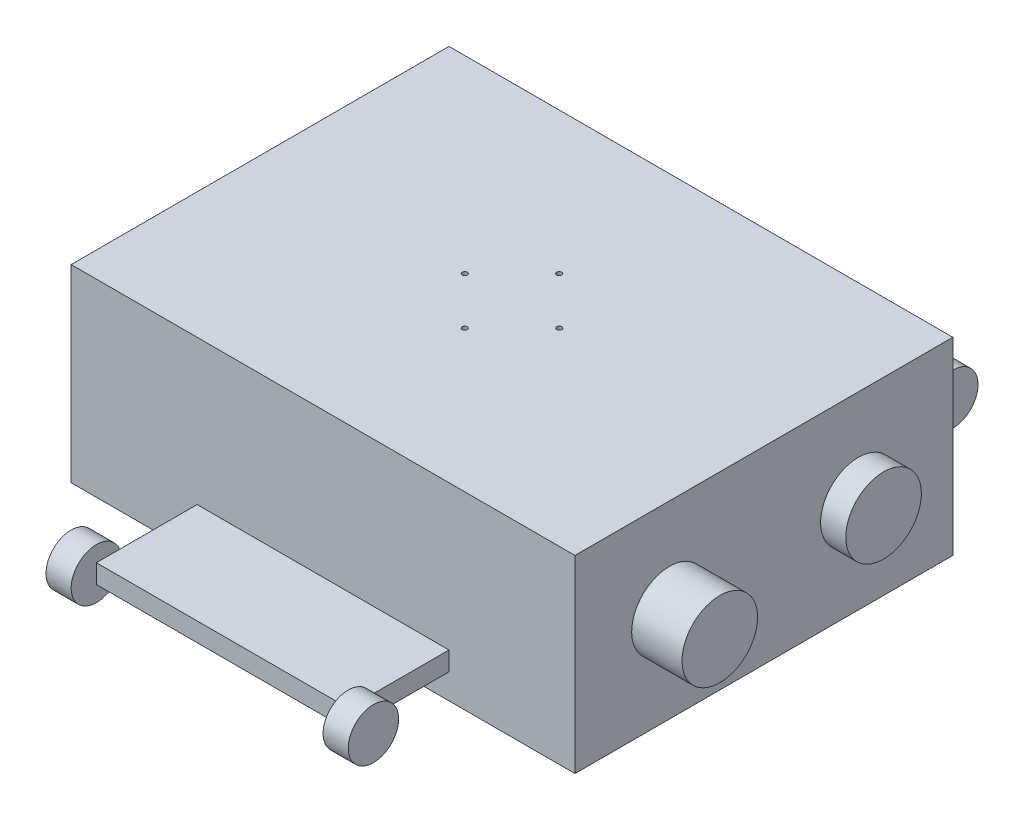
ISO-10303-21;
HEADER;
FILE_DESCRIPTION(('STEP AP214'),'2;1');
FILE_NAME('part.step','',(''),(''),'','','');
FILE_SCHEMA(('AUTOMOTIVE_DESIGN { 1 0 10303 214 1 1 1 1 }'));
ENDSEC;
DATA;
#1=APPLICATION_CONTEXT('core data for automotive mechanical design processes');
#2=APPLICATION_PROTOCOL_DEFINITION('international standard','automotive_design',2000,#1);
#3=PRODUCT_CONTEXT('',#1,'mechanical');
#4=PRODUCT('Part','Part','',(#3));
#5=PRODUCT_RELATED_PRODUCT_CATEGORY('part','',(#4));
#6=PRODUCT_DEFINITION_FORMATION('','',#4);
#7=PRODUCT_DEFINITION_CONTEXT('part definition',#1,'design');
#8=PRODUCT_DEFINITION('design','',#6,#7);
#9=PRODUCT_DEFINITION_SHAPE('','',#8);
#10=(LENGTH_UNIT() NAMED_UNIT(*) SI_UNIT(.MILLI.,.METRE.));
#11=(NAMED_UNIT(*) PLANE_ANGLE_UNIT() SI_UNIT($,.RADIAN.));
#12=(NAMED_UNIT(*) SI_UNIT($,.STERADIAN.) SOLID_ANGLE_UNIT());
#13=UNCERTAINTY_MEASURE_WITH_UNIT(LENGTH_MEASURE(1.E-05),#10,'distance_accuracy_value','');
#14=(GEOMETRIC_REPRESENTATION_CONTEXT(3) GLOBAL_UNCERTAINTY_ASSIGNED_CONTEXT((#13)) GLOBAL_UNIT_ASSIGNED_CONTEXT((#10,
#11,#12)) REPRESENTATION_CONTEXT('',''));
#15=CARTESIAN_POINT('',(0.,0.,0.));
#16=DIRECTION('',(0.,0.,1.));
#17=DIRECTION('',(1.,0.,0.));
#18=AXIS2_PLACEMENT_3D('',#15,#16,#17);
#19=CARTESIAN_POINT('',(0.,0.,0.));
#20=DIRECTION('',(0.,0.,1.));
#21=DIRECTION('',(1.,0.,0.));
#22=AXIS2_PLACEMENT_3D('',#19,#20,#21);
#23=PLANE('',#22);
#24=DIRECTION('',(0.,1.,0.));
#25=VECTOR('',#24,1.);
#26=CARTESIAN_POINT('',(200.,75.,0.));
#27=LINE('',#26,#25);
#28=CARTESIAN_POINT('',(200.,-75.,0.));
#29=VERTEX_POINT('',#28);
#30=CARTESIAN_POINT('',(200.,75.,0.));
#31=VERTEX_POINT('',#30);
#32=EDGE_CURVE('E225',#29,#31,#27,.T.);
#33=ORIENTED_EDGE('',*,*,#32,.T.);
#34=DIRECTION('',(-1.,0.,0.));
#35=VECTOR('',#34,1.);
#36=CARTESIAN_POINT('',(-200.,75.,0.));
#37=LINE('',#36,#35);
#38=CARTESIAN_POINT('',(-200.,75.,0.));
#39=VERTEX_POINT('',#38);
#40=EDGE_CURVE('E241',#31,#39,#37,.T.);
#41=ORIENTED_EDGE('',*,*,#40,.T.);
#42=DIRECTION('',(0.,-1.,0.));
#43=VECTOR('',#42,1.);
#44=CARTESIAN_POINT('',(-200.,75.,0.));
#45=LINE('',#44,#43);
#46=CARTESIAN_POINT('',(-200.,-75.,0.));
#47=VERTEX_POINT('',#46);
#48=EDGE_CURVE('E244',#39,#47,#45,.T.);
#49=ORIENTED_EDGE('',*,*,#48,.T.);
#50=DIRECTION('',(1.,0.,0.));
#51=VECTOR('',#50,1.);
#52=CARTESIAN_POINT('',(-200.,-75.,0.));
#53=LINE('',#52,#51);
#54=EDGE_CURVE('E230',#47,#29,#53,.T.);
#55=ORIENTED_EDGE('',*,*,#54,.T.);
#56=EDGE_LOOP('',(#33,#41,#49,#55));
#57=FACE_BOUND('',#56,.T.);
#58=DIRECTION('',(1.,0.,0.));
#59=VECTOR('',#58,1.);
#60=CARTESIAN_POINT('',(100.,-55.,0.));
#61=LINE('',#60,#59);
#62=CARTESIAN_POINT('',(-100.,-55.,0.));
#63=VERTEX_POINT('',#62);
#64=CARTESIAN_POINT('',(100.,-55.,0.));
#65=VERTEX_POINT('',#64);
#66=EDGE_CURVE('E530',#63,#65,#61,.T.);
#67=ORIENTED_EDGE('',*,*,#66,.F.);
#68=DIRECTION('',(0.,-1.,0.));
#69=VECTOR('',#68,1.);
#70=CARTESIAN_POINT('',(-100.,-55.,0.));
#71=LINE('',#70,#69);
#72=CARTESIAN_POINT('',(-100.,-40.,0.));
#73=VERTEX_POINT('',#72);
#74=EDGE_CURVE('E522',#73,#63,#71,.T.);
#75=ORIENTED_EDGE('',*,*,#74,.F.);
#76=DIRECTION('',(-1.,0.,0.));
#77=VECTOR('',#76,1.);
#78=CARTESIAN_POINT('',(100.,-40.,0.));
#79=LINE('',#78,#77);
#80=CARTESIAN_POINT('',(100.,-40.,0.));
#81=VERTEX_POINT('',#80);
#82=EDGE_CURVE('E185',#81,#73,#79,.T.);
#83=ORIENTED_EDGE('',*,*,#82,.F.);
#84=DIRECTION('',(0.,1.,0.));
#85=VECTOR('',#84,1.);
#86=CARTESIAN_POINT('',(100.,-55.,0.));
#87=LINE('',#86,#85);
#88=EDGE_CURVE('E532',#65,#81,#87,.T.);
#89=ORIENTED_EDGE('',*,*,#88,.F.);
#90=EDGE_LOOP('',(#67,#75,#83,#89));
#91=FACE_BOUND('',#90,.T.);
#92=ADVANCED_FACE('F43',(#57,#91),#23,.T.);
#93=CARTESIAN_POINT('',(200.,75.,-300.));
#94=DIRECTION('',(1.,0.,0.));
#95=DIRECTION('',(0.,1.,0.));
#96=AXIS2_PLACEMENT_3D('',#93,#94,#95);
#97=PLANE('',#96);
#98=CARTESIAN_POINT('',(200.,0.,-225.));
#99=DIRECTION('',(1.,0.,0.));
#100=DIRECTION('',(0.,1.,0.));
#101=AXIS2_PLACEMENT_3D('',#98,#99,#100);
#102=CIRCLE('',#101,30.);
#103=CARTESIAN_POINT('',(200.,30.0000000000001,-225.));
#104=VERTEX_POINT('',#103);
#105=EDGE_CURVE('E216',#104,#104,#102,.T.);
#106=ORIENTED_EDGE('',*,*,#105,.F.);
#107=EDGE_LOOP('',(#106));
#108=FACE_BOUND('',#107,.T.);
#109=CARTESIAN_POINT('',(200.,0.,-75.));
#110=DIRECTION('',(1.,0.,0.));
#111=DIRECTION('',(0.,1.,0.));
#112=AXIS2_PLACEMENT_3D('',#109,#110,#111);
#113=CIRCLE('',#112,30.);
#114=CARTESIAN_POINT('',(200.,30.,-75.));
#115=VERTEX_POINT('',#114);
#116=EDGE_CURVE('E220',#115,#115,#113,.T.);
#117=ORIENTED_EDGE('',*,*,#116,.F.);
#118=EDGE_LOOP('',(#117));
#119=FACE_BOUND('',#118,.T.);
#120=ORIENTED_EDGE('',*,*,#32,.F.);
#121=DIRECTION('',(0.,0.,1.));
#122=VECTOR('',#121,1.);
#123=CARTESIAN_POINT('',(200.,-75.,-300.));
#124=LINE('',#123,#122);
#125=CARTESIAN_POINT('',(200.,-75.,-300.));
#126=VERTEX_POINT('',#125);
#127=EDGE_CURVE('E11',#126,#29,#124,.T.);
#128=ORIENTED_EDGE('',*,*,#127,.F.);
#129=DIRECTION('',(0.,1.,0.));
#130=VECTOR('',#129,1.);
#131=CARTESIAN_POINT('',(200.,75.,-300.));
#132=LINE('',#131,#130);
#133=CARTESIAN_POINT('',(200.,75.,-300.));
#134=VERTEX_POINT('',#133);
#135=EDGE_CURVE('E226',#126,#134,#132,.T.);
#136=ORIENTED_EDGE('',*,*,#135,.T.);
#137=DIRECTION('',(0.,0.,1.));
#138=VECTOR('',#137,1.);
#139=CARTESIAN_POINT('',(200.,75.,-300.));
#140=LINE('',#139,#138);
#141=EDGE_CURVE('E47',#134,#31,#140,.T.);
#142=ORIENTED_EDGE('',*,*,#141,.T.);
#143=EDGE_LOOP('',(#120,#128,#136,#142));
#144=FACE_BOUND('',#143,.T.);
#145=ADVANCED_FACE('F45',(#108,#119,#144),#97,.T.);
#146=CARTESIAN_POINT('',(-200.,-75.,-300.));
#147=DIRECTION('',(0.,-1.,0.));
#148=DIRECTION('',(0.,0.,-1.));
#149=AXIS2_PLACEMENT_3D('',#146,#147,#148);
#150=PLANE('',#149);
#151=ORIENTED_EDGE('',*,*,#54,.F.);
#152=DIRECTION('',(0.,0.,1.));
#153=VECTOR('',#152,1.);
#154=CARTESIAN_POINT('',(-200.,-75.,-300.));
#155=LINE('',#154,#153);
#156=CARTESIAN_POINT('',(-200.,-75.,-300.));
#157=VERTEX_POINT('',#156);
#158=EDGE_CURVE('E52',#157,#47,#155,.T.);
#159=ORIENTED_EDGE('',*,*,#158,.F.);
#160=DIRECTION('',(1.,0.,0.));
#161=VECTOR('',#160,1.);
#162=CARTESIAN_POINT('',(-200.,-75.,-300.));
#163=LINE('',#162,#161);
#164=EDGE_CURVE('E236',#157,#126,#163,.T.);
#165=ORIENTED_EDGE('',*,*,#164,.T.);
#166=ORIENTED_EDGE('',*,*,#127,.T.);
#167=EDGE_LOOP('',(#151,#159,#165,#166));
#168=FACE_BOUND('',#167,.T.);
#169=ADVANCED_FACE('F262',(#168),#150,.T.);
#170=CARTESIAN_POINT('',(-200.,75.,-300.));
#171=DIRECTION('',(-1.,0.,0.));
#172=DIRECTION('',(0.,-1.,0.));
#173=AXIS2_PLACEMENT_3D('',#170,#171,#172);
#174=PLANE('',#173);
#175=CARTESIAN_POINT('',(-200.,0.,-75.));
#176=DIRECTION('',(-1.,0.,0.));
#177=DIRECTION('',(0.,-1.,0.));
#178=AXIS2_PLACEMENT_3D('',#175,#176,#177);
#179=CIRCLE('',#178,30.);
#180=CARTESIAN_POINT('',(-200.,-30.,-75.));
#181=VERTEX_POINT('',#180);
#182=EDGE_CURVE('E204',#181,#181,#179,.T.);
#183=ORIENTED_EDGE('',*,*,#182,.F.);
#184=EDGE_LOOP('',(#183));
#185=FACE_BOUND('',#184,.T.);
#186=CARTESIAN_POINT('',(-200.,0.,-225.));
#187=DIRECTION('',(-1.,0.,0.));
#188=DIRECTION('',(0.,-1.,0.));
#189=AXIS2_PLACEMENT_3D('',#186,#187,#188);
#190=CIRCLE('',#189,30.);
#191=CARTESIAN_POINT('',(-200.,-30.,-225.));
#192=VERTEX_POINT('',#191);
#193=EDGE_CURVE('E208',#192,#192,#190,.T.);
#194=ORIENTED_EDGE('',*,*,#193,.F.);
#195=EDGE_LOOP('',(#194));
#196=FACE_BOUND('',#195,.T.);
#197=ORIENTED_EDGE('',*,*,#48,.F.);
#198=DIRECTION('',(0.,0.,1.));
#199=VECTOR('',#198,1.);
#200=CARTESIAN_POINT('',(-200.,75.,-300.));
#201=LINE('',#200,#199);
#202=CARTESIAN_POINT('',(-200.,75.,-300.));
#203=VERTEX_POINT('',#202);
#204=EDGE_CURVE('E249',#203,#39,#201,.T.);
#205=ORIENTED_EDGE('',*,*,#204,.F.);
#206=DIRECTION('',(0.,-1.,0.));
#207=VECTOR('',#206,1.);
#208=CARTESIAN_POINT('',(-200.,75.,-300.));
#209=LINE('',#208,#207);
#210=EDGE_CURVE('E233',#203,#157,#209,.T.);
#211=ORIENTED_EDGE('',*,*,#210,.T.);
#212=ORIENTED_EDGE('',*,*,#158,.T.);
#213=EDGE_LOOP('',(#197,#205,#211,#212));
#214=FACE_BOUND('',#213,.T.);
#215=ADVANCED_FACE('F268',(#185,#196,#214),#174,.T.);
#216=CARTESIAN_POINT('',(-200.,75.,-300.));
#217=DIRECTION('',(0.,1.,0.));
#218=DIRECTION('',(0.,0.,1.));
#219=AXIS2_PLACEMENT_3D('',#216,#217,#218);
#220=PLANE('',#219);
#221=CARTESIAN_POINT('',(0.,75.,-187.5));
#222=DIRECTION('',(0.,1.,0.));
#223=DIRECTION('',(0.,0.,1.));
#224=AXIS2_PLACEMENT_3D('',#221,#222,#223);
#225=CIRCLE('',#224,2.);
#226=CARTESIAN_POINT('',(0.,75.,-185.5));
#227=VERTEX_POINT('',#226);
#228=EDGE_CURVE('E439',#227,#227,#225,.T.);
#229=ORIENTED_EDGE('',*,*,#228,.F.);
#230=EDGE_LOOP('',(#229));
#231=FACE_BOUND('',#230,.T.);
#232=CARTESIAN_POINT('',(37.5,75.,-150.));
#233=DIRECTION('',(0.,1.,0.));
#234=DIRECTION('',(0.,0.,1.));
#235=AXIS2_PLACEMENT_3D('',#232,#233,#234);
#236=CIRCLE('',#235,2.);
#237=CARTESIAN_POINT('',(37.5,75.,-148.));
#238=VERTEX_POINT('',#237);
#239=EDGE_CURVE('E447',#238,#238,#236,.T.);
#240=ORIENTED_EDGE('',*,*,#239,.F.);
#241=EDGE_LOOP('',(#240));
#242=FACE_BOUND('',#241,.T.);
#243=CARTESIAN_POINT('',(0.,75.,-112.5));
#244=DIRECTION('',(0.,1.,0.));
#245=DIRECTION('',(0.,0.,1.));
#246=AXIS2_PLACEMENT_3D('',#243,#244,#245);
#247=CIRCLE('',#246,2.);
#248=CARTESIAN_POINT('',(0.,75.,-110.5));
#249=VERTEX_POINT('',#248);
#250=EDGE_CURVE('E453',#249,#249,#247,.T.);
#251=ORIENTED_EDGE('',*,*,#250,.F.);
#252=EDGE_LOOP('',(#251));
#253=FACE_BOUND('',#252,.T.);
#254=CARTESIAN_POINT('',(-37.5,75.,-150.));
#255=DIRECTION('',(0.,1.,0.));
#256=DIRECTION('',(0.,0.,1.));
#257=AXIS2_PLACEMENT_3D('',#254,#255,#256);
#258=CIRCLE('',#257,2.);
#259=CARTESIAN_POINT('',(-37.5,75.,-148.));
#260=VERTEX_POINT('',#259);
#261=EDGE_CURVE('E459',#260,#260,#258,.T.);
#262=ORIENTED_EDGE('',*,*,#261,.F.);
#263=EDGE_LOOP('',(#262));
#264=FACE_BOUND('',#263,.T.);
#265=ORIENTED_EDGE('',*,*,#40,.F.);
#266=ORIENTED_EDGE('',*,*,#141,.F.);
#267=DIRECTION('',(-1.,0.,0.));
#268=VECTOR('',#267,1.);
#269=CARTESIAN_POINT('',(-200.,75.,-300.));
#270=LINE('',#269,#268);
#271=EDGE_CURVE('E229',#134,#203,#270,.T.);
#272=ORIENTED_EDGE('',*,*,#271,.T.);
#273=ORIENTED_EDGE('',*,*,#204,.T.);
#274=EDGE_LOOP('',(#265,#266,#272,#273));
#275=FACE_BOUND('',#274,.T.);
#276=ADVANCED_FACE('F257',(#231,#242,#253,#264,#275),#220,.T.);
#277=CARTESIAN_POINT('',(0.,0.,-300.));
#278=DIRECTION('',(0.,0.,1.));
#279=DIRECTION('',(1.,0.,0.));
#280=AXIS2_PLACEMENT_3D('',#277,#278,#279);
#281=PLANE('',#280);
#282=DIRECTION('',(-1.,0.,0.));
#283=VECTOR('',#282,1.);
#284=CARTESIAN_POINT('',(100.,-40.,-300.));
#285=LINE('',#284,#283);
#286=CARTESIAN_POINT('',(100.,-40.,-300.));
#287=VERTEX_POINT('',#286);
#288=CARTESIAN_POINT('',(-100.,-40.,-300.));
#289=VERTEX_POINT('',#288);
#290=EDGE_CURVE('E501',#287,#289,#285,.T.);
#291=ORIENTED_EDGE('',*,*,#290,.T.);
#292=DIRECTION('',(0.,-1.,0.));
#293=VECTOR('',#292,1.);
#294=CARTESIAN_POINT('',(-100.,-55.,-300.));
#295=LINE('',#294,#293);
#296=CARTESIAN_POINT('',(-100.,-55.,-300.));
#297=VERTEX_POINT('',#296);
#298=EDGE_CURVE('E481',#289,#297,#295,.T.);
#299=ORIENTED_EDGE('',*,*,#298,.T.);
#300=DIRECTION('',(1.,0.,0.));
#301=VECTOR('',#300,1.);
#302=CARTESIAN_POINT('',(100.,-55.,-300.));
#303=LINE('',#302,#301);
#304=CARTESIAN_POINT('',(100.,-55.,-300.));
#305=VERTEX_POINT('',#304);
#306=EDGE_CURVE('E489',#297,#305,#303,.T.);
#307=ORIENTED_EDGE('',*,*,#306,.T.);
#308=DIRECTION('',(0.,1.,0.));
#309=VECTOR('',#308,1.);
#310=CARTESIAN_POINT('',(100.,-55.,-300.));
#311=LINE('',#310,#309);
#312=EDGE_CURVE('E504',#305,#287,#311,.T.);
#313=ORIENTED_EDGE('',*,*,#312,.T.);
#314=EDGE_LOOP('',(#291,#299,#307,#313));
#315=FACE_BOUND('',#314,.T.);
#316=ORIENTED_EDGE('',*,*,#135,.F.);
#317=ORIENTED_EDGE('',*,*,#164,.F.);
#318=ORIENTED_EDGE('',*,*,#210,.F.);
#319=ORIENTED_EDGE('',*,*,#271,.F.);
#320=EDGE_LOOP('',(#316,#317,#318,#319));
#321=FACE_BOUND('',#320,.T.);
#322=ADVANCED_FACE('F265',(#315,#321),#281,.F.);
#323=CARTESIAN_POINT('',(220.,0.,-75.));
#324=DIRECTION('',(-1.,0.,0.));
#325=DIRECTION('',(0.,-1.,0.));
#326=AXIS2_PLACEMENT_3D('',#323,#324,#325);
#327=CYLINDRICAL_SURFACE('',#326,30.);
#328=ORIENTED_EDGE('',*,*,#116,.T.);
#329=EDGE_LOOP('',(#328));
#330=FACE_BOUND('',#329,.T.);
#331=CARTESIAN_POINT('',(240.,0.,-75.));
#332=DIRECTION('',(1.,0.,0.));
#333=DIRECTION('',(0.,1.,0.));
#334=AXIS2_PLACEMENT_3D('',#331,#332,#333);
#335=CIRCLE('',#334,30.);
#336=CARTESIAN_POINT('',(240.,30.0000000000001,-75.));
#337=VERTEX_POINT('',#336);
#338=EDGE_CURVE('E213',#337,#337,#335,.T.);
#339=ORIENTED_EDGE('',*,*,#338,.F.);
#340=EDGE_LOOP('',(#339));
#341=FACE_BOUND('',#340,.T.);
#342=ADVANCED_FACE('F291',(#330,#341),#327,.T.);
#343=CARTESIAN_POINT('',(220.,0.,-225.));
#344=DIRECTION('',(-1.,0.,0.));
#345=DIRECTION('',(0.,-1.,0.));
#346=AXIS2_PLACEMENT_3D('',#343,#344,#345);
#347=CYLINDRICAL_SURFACE('',#346,30.);
#348=CARTESIAN_POINT('',(220.,0.,-225.));
#349=DIRECTION('',(1.,0.,0.));
#350=DIRECTION('',(0.,1.,0.));
#351=AXIS2_PLACEMENT_3D('',#348,#349,#350);
#352=CIRCLE('',#351,30.);
#353=CARTESIAN_POINT('',(220.,30.0000000000001,-225.));
#354=VERTEX_POINT('',#353);
#355=EDGE_CURVE('E217',#354,#354,#352,.T.);
#356=ORIENTED_EDGE('',*,*,#355,.F.);
#357=EDGE_LOOP('',(#356));
#358=FACE_BOUND('',#357,.T.);
#359=ORIENTED_EDGE('',*,*,#105,.T.);
#360=EDGE_LOOP('',(#359));
#361=FACE_BOUND('',#360,.T.);
#362=ADVANCED_FACE('F295',(#358,#361),#347,.T.);
#363=CARTESIAN_POINT('',(220.,0.,-225.));
#364=DIRECTION('',(1.,0.,0.));
#365=DIRECTION('',(0.,1.,0.));
#366=AXIS2_PLACEMENT_3D('',#363,#364,#365);
#367=PLANE('',#366);
#368=ORIENTED_EDGE('',*,*,#355,.T.);
#369=EDGE_LOOP('',(#368));
#370=FACE_BOUND('',#369,.T.);
#371=ADVANCED_FACE('F299',(#370),#367,.T.);
#372=CARTESIAN_POINT('',(240.,0.,-75.));
#373=DIRECTION('',(1.,0.,0.));
#374=DIRECTION('',(0.,1.,0.));
#375=AXIS2_PLACEMENT_3D('',#372,#373,#374);
#376=PLANE('',#375);
#377=ORIENTED_EDGE('',*,*,#338,.T.);
#378=EDGE_LOOP('',(#377));
#379=FACE_BOUND('',#378,.T.);
#380=ADVANCED_FACE('F303',(#379),#376,.T.);
#381=CARTESIAN_POINT('',(-220.,0.,-225.));
#382=DIRECTION('',(1.,0.,0.));
#383=DIRECTION('',(0.,1.,0.));
#384=AXIS2_PLACEMENT_3D('',#381,#382,#383);
#385=CYLINDRICAL_SURFACE('',#384,30.);
#386=ORIENTED_EDGE('',*,*,#193,.T.);
#387=EDGE_LOOP('',(#386));
#388=FACE_BOUND('',#387,.T.);
#389=CARTESIAN_POINT('',(-240.,0.,-225.));
#390=DIRECTION('',(-1.,0.,0.));
#391=DIRECTION('',(0.,-1.,0.));
#392=AXIS2_PLACEMENT_3D('',#389,#390,#391);
#393=CIRCLE('',#392,30.);
#394=CARTESIAN_POINT('',(-240.,-30.,-225.));
#395=VERTEX_POINT('',#394);
#396=EDGE_CURVE('E201',#395,#395,#393,.T.);
#397=ORIENTED_EDGE('',*,*,#396,.F.);
#398=EDGE_LOOP('',(#397));
#399=FACE_BOUND('',#398,.T.);
#400=ADVANCED_FACE('F307',(#388,#399),#385,.T.);
#401=CARTESIAN_POINT('',(-220.,0.,-75.));
#402=DIRECTION('',(1.,0.,0.));
#403=DIRECTION('',(0.,1.,0.));
#404=AXIS2_PLACEMENT_3D('',#401,#402,#403);
#405=CYLINDRICAL_SURFACE('',#404,30.);
#406=CARTESIAN_POINT('',(-220.,0.,-75.));
#407=DIRECTION('',(-1.,0.,0.));
#408=DIRECTION('',(0.,-1.,0.));
#409=AXIS2_PLACEMENT_3D('',#406,#407,#408);
#410=CIRCLE('',#409,30.);
#411=CARTESIAN_POINT('',(-220.,-30.,-75.));
#412=VERTEX_POINT('',#411);
#413=EDGE_CURVE('E205',#412,#412,#410,.T.);
#414=ORIENTED_EDGE('',*,*,#413,.F.);
#415=EDGE_LOOP('',(#414));
#416=FACE_BOUND('',#415,.T.);
#417=ORIENTED_EDGE('',*,*,#182,.T.);
#418=EDGE_LOOP('',(#417));
#419=FACE_BOUND('',#418,.T.);
#420=ADVANCED_FACE('F311',(#416,#419),#405,.T.);
#421=CARTESIAN_POINT('',(-220.,0.,-75.));
#422=DIRECTION('',(-1.,0.,0.));
#423=DIRECTION('',(0.,-1.,0.));
#424=AXIS2_PLACEMENT_3D('',#421,#422,#423);
#425=PLANE('',#424);
#426=ORIENTED_EDGE('',*,*,#413,.T.);
#427=EDGE_LOOP('',(#426));
#428=FACE_BOUND('',#427,.T.);
#429=ADVANCED_FACE('F315',(#428),#425,.T.);
#430=CARTESIAN_POINT('',(-240.,0.,-225.));
#431=DIRECTION('',(-1.,0.,0.));
#432=DIRECTION('',(0.,-1.,0.));
#433=AXIS2_PLACEMENT_3D('',#430,#431,#432);
#434=PLANE('',#433);
#435=ORIENTED_EDGE('',*,*,#396,.T.);
#436=EDGE_LOOP('',(#435));
#437=FACE_BOUND('',#436,.T.);
#438=ADVANCED_FACE('F319',(#437),#434,.T.);
#439=CARTESIAN_POINT('',(-100.,-55.,80.));
#440=DIRECTION('',(1.,0.,0.));
#441=DIRECTION('',(0.,0.,-1.));
#442=AXIS2_PLACEMENT_3D('',#439,#440,#441);
#443=PLANE('',#442);
#444=DIRECTION('',(0.,0.,-1.));
#445=VECTOR('',#444,1.);
#446=CARTESIAN_POINT('',(-100.,-55.,80.));
#447=LINE('',#446,#445);
#448=CARTESIAN_POINT('',(-100.,-55.,61.4595037822609));
#449=VERTEX_POINT('',#448);
#450=EDGE_CURVE('E180',#449,#63,#447,.T.);
#451=ORIENTED_EDGE('',*,*,#450,.F.);
#452=CARTESIAN_POINT('',(-100.,-47.5,80.));
#453=DIRECTION('',(1.,0.,0.));
#454=DIRECTION('',(0.,0.,-1.));
#455=AXIS2_PLACEMENT_3D('',#452,#453,#454);
#456=CIRCLE('',#455,20.);
#457=CARTESIAN_POINT('',(-100.,-40.,61.4595037822608));
#458=VERTEX_POINT('',#457);
#459=EDGE_CURVE('E173',#449,#458,#456,.T.);
#460=ORIENTED_EDGE('',*,*,#459,.T.);
#461=DIRECTION('',(0.,0.,-1.));
#462=VECTOR('',#461,1.);
#463=CARTESIAN_POINT('',(-100.,-40.,80.));
#464=LINE('',#463,#462);
#465=EDGE_CURVE('E168',#458,#73,#464,.T.);
#466=ORIENTED_EDGE('',*,*,#465,.T.);
#467=ORIENTED_EDGE('',*,*,#74,.T.);
#468=EDGE_LOOP('',(#451,#460,#466,#467));
#469=FACE_BOUND('',#468,.T.);
#470=ADVANCED_FACE('F177',(#469),#443,.F.);
#471=CARTESIAN_POINT('',(100.,-55.,80.));
#472=DIRECTION('',(0.,1.,0.));
#473=DIRECTION('',(-1.,0.,0.));
#474=AXIS2_PLACEMENT_3D('',#471,#472,#473);
#475=PLANE('',#474);
#476=ORIENTED_EDGE('',*,*,#66,.T.);
#477=DIRECTION('',(0.,0.,-1.));
#478=VECTOR('',#477,1.);
#479=CARTESIAN_POINT('',(100.,-55.,80.));
#480=LINE('',#479,#478);
#481=CARTESIAN_POINT('',(100.,-55.,61.4595037822608));
#482=VERTEX_POINT('',#481);
#483=EDGE_CURVE('E196',#482,#65,#480,.T.);
#484=ORIENTED_EDGE('',*,*,#483,.F.);
#485=CARTESIAN_POINT('',(100.,-55.,80.));
#486=VERTEX_POINT('',#485);
#487=EDGE_CURVE('E197',#486,#482,#480,.T.);
#488=ORIENTED_EDGE('',*,*,#487,.F.);
#489=DIRECTION('',(1.,0.,0.));
#490=VECTOR('',#489,1.);
#491=CARTESIAN_POINT('',(100.,-55.,80.));
#492=LINE('',#491,#490);
#493=CARTESIAN_POINT('',(-100.,-55.,80.));
#494=VERTEX_POINT('',#493);
#495=EDGE_CURVE('E524',#494,#486,#492,.T.);
#496=ORIENTED_EDGE('',*,*,#495,.F.);
#497=EDGE_CURVE('E199',#494,#449,#447,.T.);
#498=ORIENTED_EDGE('',*,*,#497,.T.);
#499=ORIENTED_EDGE('',*,*,#450,.T.);
#500=EDGE_LOOP('',(#476,#484,#488,#496,#498,#499));
#501=FACE_BOUND('',#500,.T.);
#502=ADVANCED_FACE('F326',(#501),#475,.F.);
#503=CARTESIAN_POINT('',(100.,-55.,80.));
#504=DIRECTION('',(-1.,0.,0.));
#505=DIRECTION('',(0.,0.,1.));
#506=AXIS2_PLACEMENT_3D('',#503,#504,#505);
#507=PLANE('',#506);
#508=CARTESIAN_POINT('',(100.,-47.5,80.));
#509=DIRECTION('',(1.,0.,0.));
#510=DIRECTION('',(0.,0.,-1.));
#511=AXIS2_PLACEMENT_3D('',#508,#509,#510);
#512=CIRCLE('',#511,20.);
#513=CARTESIAN_POINT('',(100.,-40.,61.4595037822608));
#514=VERTEX_POINT('',#513);
#515=EDGE_CURVE('E474',#482,#514,#512,.T.);
#516=ORIENTED_EDGE('',*,*,#515,.F.);
#517=ORIENTED_EDGE('',*,*,#483,.T.);
#518=ORIENTED_EDGE('',*,*,#88,.T.);
#519=DIRECTION('',(0.,0.,-1.));
#520=VECTOR('',#519,1.);
#521=CARTESIAN_POINT('',(100.,-40.,80.));
#522=LINE('',#521,#520);
#523=EDGE_CURVE('E167',#514,#81,#522,.T.);
#524=ORIENTED_EDGE('',*,*,#523,.F.);
#525=EDGE_LOOP('',(#516,#517,#518,#524));
#526=FACE_BOUND('',#525,.T.);
#527=ADVANCED_FACE('F329',(#526),#507,.F.);
#528=CARTESIAN_POINT('',(100.,-40.,80.));
#529=DIRECTION('',(0.,-1.,0.));
#530=DIRECTION('',(1.,0.,0.));
#531=AXIS2_PLACEMENT_3D('',#528,#529,#530);
#532=PLANE('',#531);
#533=ORIENTED_EDGE('',*,*,#82,.T.);
#534=ORIENTED_EDGE('',*,*,#465,.F.);
#535=CARTESIAN_POINT('',(-100.,-40.,80.));
#536=VERTEX_POINT('',#535);
#537=EDGE_CURVE('E156',#536,#458,#464,.T.);
#538=ORIENTED_EDGE('',*,*,#537,.F.);
#539=DIRECTION('',(-1.,0.,0.));
#540=VECTOR('',#539,1.);
#541=CARTESIAN_POINT('',(100.,-40.,80.));
#542=LINE('',#541,#540);
#543=CARTESIAN_POINT('',(100.,-40.,80.));
#544=VERTEX_POINT('',#543);
#545=EDGE_CURVE('E187',#544,#536,#542,.T.);
#546=ORIENTED_EDGE('',*,*,#545,.F.);
#547=EDGE_CURVE('E193',#544,#514,#522,.T.);
#548=ORIENTED_EDGE('',*,*,#547,.T.);
#549=ORIENTED_EDGE('',*,*,#523,.T.);
#550=EDGE_LOOP('',(#533,#534,#538,#546,#548,#549));
#551=FACE_BOUND('',#550,.T.);
#552=ADVANCED_FACE('F183',(#551),#532,.F.);
#553=CARTESIAN_POINT('',(0.,0.,80.));
#554=DIRECTION('',(0.,0.,1.));
#555=DIRECTION('',(1.,0.,0.));
#556=AXIS2_PLACEMENT_3D('',#553,#554,#555);
#557=PLANE('',#556);
#558=DIRECTION('',(0.,-1.,0.));
#559=VECTOR('',#558,1.);
#560=CARTESIAN_POINT('',(-100.,-55.,80.));
#561=LINE('',#560,#559);
#562=EDGE_CURVE('E162',#536,#494,#561,.T.);
#563=ORIENTED_EDGE('',*,*,#562,.T.);
#564=ORIENTED_EDGE('',*,*,#495,.T.);
#565=DIRECTION('',(0.,1.,0.));
#566=VECTOR('',#565,1.);
#567=CARTESIAN_POINT('',(100.,-55.,80.));
#568=LINE('',#567,#566);
#569=EDGE_CURVE('E188',#486,#544,#568,.T.);
#570=ORIENTED_EDGE('',*,*,#569,.T.);
#571=ORIENTED_EDGE('',*,*,#545,.T.);
#572=EDGE_LOOP('',(#563,#564,#570,#571));
#573=FACE_BOUND('',#572,.T.);
#574=ADVANCED_FACE('F336',(#573),#557,.T.);
#575=CARTESIAN_POINT('',(-100.,-55.,-380.));
#576=DIRECTION('',(-1.,0.,0.));
#577=DIRECTION('',(0.,0.,1.));
#578=AXIS2_PLACEMENT_3D('',#575,#576,#577);
#579=PLANE('',#578);
#580=DIRECTION('',(0.,0.,1.));
#581=VECTOR('',#580,1.);
#582=CARTESIAN_POINT('',(-100.,-40.,-380.));
#583=LINE('',#582,#581);
#584=CARTESIAN_POINT('',(-100.,-40.,-361.459503782261));
#585=VERTEX_POINT('',#584);
#586=EDGE_CURVE('E60',#585,#289,#583,.T.);
#587=ORIENTED_EDGE('',*,*,#586,.F.);
#588=CARTESIAN_POINT('',(-100.,-47.5,-380.));
#589=DIRECTION('',(-1.,0.,0.));
#590=DIRECTION('',(0.,0.,1.));
#591=AXIS2_PLACEMENT_3D('',#588,#589,#590);
#592=CIRCLE('',#591,20.);
#593=CARTESIAN_POINT('',(-100.,-55.,-361.459503782261));
#594=VERTEX_POINT('',#593);
#595=EDGE_CURVE('E65',#594,#585,#592,.T.);
#596=ORIENTED_EDGE('',*,*,#595,.F.);
#597=DIRECTION('',(0.,0.,1.));
#598=VECTOR('',#597,1.);
#599=CARTESIAN_POINT('',(-100.,-55.,-380.));
#600=LINE('',#599,#598);
#601=EDGE_CURVE('E498',#594,#297,#600,.T.);
#602=ORIENTED_EDGE('',*,*,#601,.T.);
#603=ORIENTED_EDGE('',*,*,#298,.F.);
#604=EDGE_LOOP('',(#587,#596,#602,#603));
#605=FACE_BOUND('',#604,.T.);
#606=ADVANCED_FACE('F339',(#605),#579,.T.);
#607=CARTESIAN_POINT('',(100.,-40.,-380.));
#608=DIRECTION('',(0.,1.,0.));
#609=DIRECTION('',(-1.,0.,0.));
#610=AXIS2_PLACEMENT_3D('',#607,#608,#609);
#611=PLANE('',#610);
#612=ORIENTED_EDGE('',*,*,#290,.F.);
#613=DIRECTION('',(0.,0.,1.));
#614=VECTOR('',#613,1.);
#615=CARTESIAN_POINT('',(100.,-40.,-380.));
#616=LINE('',#615,#614);
#617=CARTESIAN_POINT('',(100.,-40.,-361.459503782261));
#618=VERTEX_POINT('',#617);
#619=EDGE_CURVE('E516',#618,#287,#616,.T.);
#620=ORIENTED_EDGE('',*,*,#619,.F.);
#621=CARTESIAN_POINT('',(100.,-40.,-380.));
#622=VERTEX_POINT('',#621);
#623=EDGE_CURVE('E517',#622,#618,#616,.T.);
#624=ORIENTED_EDGE('',*,*,#623,.F.);
#625=DIRECTION('',(-1.,0.,0.));
#626=VECTOR('',#625,1.);
#627=CARTESIAN_POINT('',(100.,-40.,-380.));
#628=LINE('',#627,#626);
#629=CARTESIAN_POINT('',(-100.,-40.,-380.));
#630=VERTEX_POINT('',#629);
#631=EDGE_CURVE('E488',#622,#630,#628,.T.);
#632=ORIENTED_EDGE('',*,*,#631,.T.);
#633=EDGE_CURVE('E520',#630,#585,#583,.T.);
#634=ORIENTED_EDGE('',*,*,#633,.T.);
#635=ORIENTED_EDGE('',*,*,#586,.T.);
#636=EDGE_LOOP('',(#612,#620,#624,#632,#634,#635));
#637=FACE_BOUND('',#636,.T.);
#638=ADVANCED_FACE('F343',(#637),#611,.T.);
#639=CARTESIAN_POINT('',(100.,-55.,-380.));
#640=DIRECTION('',(1.,0.,0.));
#641=DIRECTION('',(0.,0.,-1.));
#642=AXIS2_PLACEMENT_3D('',#639,#640,#641);
#643=PLANE('',#642);
#644=CARTESIAN_POINT('',(100.,-47.5,-380.));
#645=DIRECTION('',(-1.,0.,0.));
#646=DIRECTION('',(0.,0.,1.));
#647=AXIS2_PLACEMENT_3D('',#644,#645,#646);
#648=CIRCLE('',#647,20.);
#649=CARTESIAN_POINT('',(100.,-55.,-361.459503782261));
#650=VERTEX_POINT('',#649);
#651=EDGE_CURVE('E467',#650,#618,#648,.T.);
#652=ORIENTED_EDGE('',*,*,#651,.T.);
#653=ORIENTED_EDGE('',*,*,#619,.T.);
#654=ORIENTED_EDGE('',*,*,#312,.F.);
#655=DIRECTION('',(0.,0.,1.));
#656=VECTOR('',#655,1.);
#657=CARTESIAN_POINT('',(100.,-55.,-380.));
#658=LINE('',#657,#656);
#659=EDGE_CURVE('E512',#650,#305,#658,.T.);
#660=ORIENTED_EDGE('',*,*,#659,.F.);
#661=EDGE_LOOP('',(#652,#653,#654,#660));
#662=FACE_BOUND('',#661,.T.);
#663=ADVANCED_FACE('F346',(#662),#643,.T.);
#664=CARTESIAN_POINT('',(100.,-55.,-380.));
#665=DIRECTION('',(0.,-1.,0.));
#666=DIRECTION('',(1.,0.,0.));
#667=AXIS2_PLACEMENT_3D('',#664,#665,#666);
#668=PLANE('',#667);
#669=ORIENTED_EDGE('',*,*,#306,.F.);
#670=ORIENTED_EDGE('',*,*,#601,.F.);
#671=CARTESIAN_POINT('',(-100.,-55.,-380.));
#672=VERTEX_POINT('',#671);
#673=EDGE_CURVE('E509',#672,#594,#600,.T.);
#674=ORIENTED_EDGE('',*,*,#673,.F.);
#675=DIRECTION('',(1.,0.,0.));
#676=VECTOR('',#675,1.);
#677=CARTESIAN_POINT('',(100.,-55.,-380.));
#678=LINE('',#677,#676);
#679=CARTESIAN_POINT('',(100.,-55.,-380.));
#680=VERTEX_POINT('',#679);
#681=EDGE_CURVE('E495',#672,#680,#678,.T.);
#682=ORIENTED_EDGE('',*,*,#681,.T.);
#683=EDGE_CURVE('E513',#680,#650,#658,.T.);
#684=ORIENTED_EDGE('',*,*,#683,.T.);
#685=ORIENTED_EDGE('',*,*,#659,.T.);
#686=EDGE_LOOP('',(#669,#670,#674,#682,#684,#685));
#687=FACE_BOUND('',#686,.T.);
#688=ADVANCED_FACE('F350',(#687),#668,.T.);
#689=CARTESIAN_POINT('',(0.,0.,-380.));
#690=DIRECTION('',(0.,0.,-1.));
#691=DIRECTION('',(1.,0.,0.));
#692=AXIS2_PLACEMENT_3D('',#689,#690,#691);
#693=PLANE('',#692);
#694=DIRECTION('',(0.,-1.,0.));
#695=VECTOR('',#694,1.);
#696=CARTESIAN_POINT('',(-100.,-55.,-380.));
#697=LINE('',#696,#695);
#698=EDGE_CURVE('E485',#630,#672,#697,.T.);
#699=ORIENTED_EDGE('',*,*,#698,.F.);
#700=ORIENTED_EDGE('',*,*,#631,.F.);
#701=DIRECTION('',(0.,1.,0.));
#702=VECTOR('',#701,1.);
#703=CARTESIAN_POINT('',(100.,-55.,-380.));
#704=LINE('',#703,#702);
#705=EDGE_CURVE('E492',#680,#622,#704,.T.);
#706=ORIENTED_EDGE('',*,*,#705,.F.);
#707=ORIENTED_EDGE('',*,*,#681,.F.);
#708=EDGE_LOOP('',(#699,#700,#706,#707));
#709=FACE_BOUND('',#708,.T.);
#710=ADVANCED_FACE('F354',(#709),#693,.T.);
#711=CARTESIAN_POINT('',(100.,-47.5,80.));
#712=DIRECTION('',(1.,0.,0.));
#713=DIRECTION('',(0.,0.,-1.));
#714=AXIS2_PLACEMENT_3D('',#711,#712,#713);
#715=PLANE('',#714);
#716=ORIENTED_EDGE('',*,*,#569,.F.);
#717=ORIENTED_EDGE('',*,*,#487,.T.);
#718=EDGE_CURVE('E482',#514,#482,#512,.T.);
#719=ORIENTED_EDGE('',*,*,#718,.F.);
#720=ORIENTED_EDGE('',*,*,#547,.F.);
#721=EDGE_LOOP('',(#716,#717,#719,#720));
#722=FACE_BOUND('',#721,.T.);
#723=ADVANCED_FACE('F358',(#722),#715,.F.);
#724=CARTESIAN_POINT('',(120.,-47.5,80.));
#725=DIRECTION('',(-1.,0.,0.));
#726=DIRECTION('',(0.,0.,1.));
#727=AXIS2_PLACEMENT_3D('',#724,#725,#726);
#728=CYLINDRICAL_SURFACE('',#727,20.);
#729=CARTESIAN_POINT('',(120.,-47.5,80.));
#730=DIRECTION('',(1.,0.,0.));
#731=DIRECTION('',(0.,0.,-1.));
#732=AXIS2_PLACEMENT_3D('',#729,#730,#731);
#733=CIRCLE('',#732,20.);
#734=CARTESIAN_POINT('',(120.,-47.5,60.));
#735=VERTEX_POINT('',#734);
#736=EDGE_CURVE('E478',#735,#735,#733,.T.);
#737=ORIENTED_EDGE('',*,*,#736,.F.);
#738=EDGE_LOOP('',(#737));
#739=FACE_BOUND('',#738,.T.);
#740=ORIENTED_EDGE('',*,*,#718,.T.);
#741=ORIENTED_EDGE('',*,*,#515,.T.);
#742=EDGE_LOOP('',(#740,#741));
#743=FACE_BOUND('',#742,.T.);
#744=ADVANCED_FACE('F360',(#739,#743),#728,.T.);
#745=CARTESIAN_POINT('',(120.,-47.5,80.));
#746=DIRECTION('',(1.,0.,0.));
#747=DIRECTION('',(0.,0.,-1.));
#748=AXIS2_PLACEMENT_3D('',#745,#746,#747);
#749=PLANE('',#748);
#750=ORIENTED_EDGE('',*,*,#736,.T.);
#751=EDGE_LOOP('',(#750));
#752=FACE_BOUND('',#751,.T.);
#753=ADVANCED_FACE('F363',(#752),#749,.T.);
#754=CARTESIAN_POINT('',(120.,-47.5,-380.));
#755=DIRECTION('',(-1.,0.,0.));
#756=DIRECTION('',(0.,0.,1.));
#757=AXIS2_PLACEMENT_3D('',#754,#755,#756);
#758=CYLINDRICAL_SURFACE('',#757,20.);
#759=CARTESIAN_POINT('',(120.,-47.5,-380.));
#760=DIRECTION('',(-1.,0.,0.));
#761=DIRECTION('',(0.,0.,1.));
#762=AXIS2_PLACEMENT_3D('',#759,#760,#761);
#763=CIRCLE('',#762,20.);
#764=CARTESIAN_POINT('',(120.,-47.5,-360.));
#765=VERTEX_POINT('',#764);
#766=EDGE_CURVE('E471',#765,#765,#763,.T.);
#767=ORIENTED_EDGE('',*,*,#766,.T.);
#768=EDGE_LOOP('',(#767));
#769=FACE_BOUND('',#768,.T.);
#770=EDGE_CURVE('E475',#618,#650,#648,.T.);
#771=ORIENTED_EDGE('',*,*,#770,.F.);
#772=ORIENTED_EDGE('',*,*,#651,.F.);
#773=EDGE_LOOP('',(#771,#772));
#774=FACE_BOUND('',#773,.T.);
#775=ADVANCED_FACE('F370',(#769,#774),#758,.T.);
#776=CARTESIAN_POINT('',(120.,-47.5,-380.));
#777=DIRECTION('',(1.,0.,0.));
#778=DIRECTION('',(0.,0.,1.));
#779=AXIS2_PLACEMENT_3D('',#776,#777,#778);
#780=PLANE('',#779);
#781=ORIENTED_EDGE('',*,*,#766,.F.);
#782=EDGE_LOOP('',(#781));
#783=FACE_BOUND('',#782,.T.);
#784=ADVANCED_FACE('F374',(#783),#780,.T.);
#785=CARTESIAN_POINT('',(100.,-47.5,-380.));
#786=DIRECTION('',(1.,0.,0.));
#787=DIRECTION('',(0.,0.,1.));
#788=AXIS2_PLACEMENT_3D('',#785,#786,#787);
#789=PLANE('',#788);
#790=ORIENTED_EDGE('',*,*,#623,.T.);
#791=ORIENTED_EDGE('',*,*,#770,.T.);
#792=ORIENTED_EDGE('',*,*,#683,.F.);
#793=ORIENTED_EDGE('',*,*,#705,.T.);
#794=EDGE_LOOP('',(#790,#791,#792,#793));
#795=FACE_BOUND('',#794,.T.);
#796=ADVANCED_FACE('F376',(#795),#789,.F.);
#797=CARTESIAN_POINT('',(-120.,-47.5,-380.));
#798=DIRECTION('',(1.,0.,0.));
#799=DIRECTION('',(0.,0.,-1.));
#800=AXIS2_PLACEMENT_3D('',#797,#798,#799);
#801=CYLINDRICAL_SURFACE('',#800,20.);
#802=CARTESIAN_POINT('',(-120.,-47.5,-380.));
#803=DIRECTION('',(-1.,0.,0.));
#804=DIRECTION('',(0.,0.,1.));
#805=AXIS2_PLACEMENT_3D('',#802,#803,#804);
#806=CIRCLE('',#805,20.);
#807=CARTESIAN_POINT('',(-120.,-47.5,-360.));
#808=VERTEX_POINT('',#807);
#809=EDGE_CURVE('E464',#808,#808,#806,.T.);
#810=ORIENTED_EDGE('',*,*,#809,.F.);
#811=EDGE_LOOP('',(#810));
#812=FACE_BOUND('',#811,.T.);
#813=EDGE_CURVE('E468',#585,#594,#592,.T.);
#814=ORIENTED_EDGE('',*,*,#813,.T.);
#815=ORIENTED_EDGE('',*,*,#595,.T.);
#816=EDGE_LOOP('',(#814,#815));
#817=FACE_BOUND('',#816,.T.);
#818=ADVANCED_FACE('F379',(#812,#817),#801,.T.);
#819=CARTESIAN_POINT('',(-120.,-47.5,-380.));
#820=DIRECTION('',(-1.,0.,0.));
#821=DIRECTION('',(0.,0.,1.));
#822=AXIS2_PLACEMENT_3D('',#819,#820,#821);
#823=PLANE('',#822);
#824=ORIENTED_EDGE('',*,*,#809,.T.);
#825=EDGE_LOOP('',(#824));
#826=FACE_BOUND('',#825,.T.);
#827=ADVANCED_FACE('F386',(#826),#823,.T.);
#828=CARTESIAN_POINT('',(-100.,-47.5,-380.));
#829=DIRECTION('',(-1.,0.,0.));
#830=DIRECTION('',(0.,0.,1.));
#831=AXIS2_PLACEMENT_3D('',#828,#829,#830);
#832=PLANE('',#831);
#833=ORIENTED_EDGE('',*,*,#633,.F.);
#834=ORIENTED_EDGE('',*,*,#698,.T.);
#835=ORIENTED_EDGE('',*,*,#673,.T.);
#836=ORIENTED_EDGE('',*,*,#813,.F.);
#837=EDGE_LOOP('',(#833,#834,#835,#836));
#838=FACE_BOUND('',#837,.T.);
#839=ADVANCED_FACE('F388',(#838),#832,.F.);
#840=CARTESIAN_POINT('',(-100.,-47.5,80.));
#841=DIRECTION('',(-1.,0.,0.));
#842=DIRECTION('',(0.,0.,-1.));
#843=AXIS2_PLACEMENT_3D('',#840,#841,#842);
#844=PLANE('',#843);
#845=EDGE_CURVE('E159',#458,#449,#456,.T.);
#846=ORIENTED_EDGE('',*,*,#845,.T.);
#847=ORIENTED_EDGE('',*,*,#497,.F.);
#848=ORIENTED_EDGE('',*,*,#562,.F.);
#849=ORIENTED_EDGE('',*,*,#537,.T.);
#850=EDGE_LOOP('',(#846,#847,#848,#849));
#851=FACE_BOUND('',#850,.T.);
#852=ADVANCED_FACE('F158',(#851),#844,.F.);
#853=CARTESIAN_POINT('',(-120.,-47.5,80.));
#854=DIRECTION('',(1.,0.,0.));
#855=DIRECTION('',(0.,0.,-1.));
#856=AXIS2_PLACEMENT_3D('',#853,#854,#855);
#857=CYLINDRICAL_SURFACE('',#856,20.);
#858=CARTESIAN_POINT('',(-120.,-47.5,80.));
#859=DIRECTION('',(1.,0.,0.));
#860=DIRECTION('',(0.,0.,-1.));
#861=AXIS2_PLACEMENT_3D('',#858,#859,#860);
#862=CIRCLE('',#861,20.);
#863=CARTESIAN_POINT('',(-120.,-47.5,60.));
#864=VERTEX_POINT('',#863);
#865=EDGE_CURVE('E174',#864,#864,#862,.T.);
#866=ORIENTED_EDGE('',*,*,#865,.T.);
#867=EDGE_LOOP('',(#866));
#868=FACE_BOUND('',#867,.T.);
#869=ORIENTED_EDGE('',*,*,#845,.F.);
#870=ORIENTED_EDGE('',*,*,#459,.F.);
#871=EDGE_LOOP('',(#869,#870));
#872=FACE_BOUND('',#871,.T.);
#873=ADVANCED_FACE('F172',(#868,#872),#857,.T.);
#874=CARTESIAN_POINT('',(-120.,-47.5,80.));
#875=DIRECTION('',(-1.,0.,0.));
#876=DIRECTION('',(0.,0.,-1.));
#877=AXIS2_PLACEMENT_3D('',#874,#875,#876);
#878=PLANE('',#877);
#879=ORIENTED_EDGE('',*,*,#865,.F.);
#880=EDGE_LOOP('',(#879));
#881=FACE_BOUND('',#880,.T.);
#882=ADVANCED_FACE('F397',(#881),#878,.T.);
#883=CARTESIAN_POINT('',(-37.5,65.,-150.));
#884=DIRECTION('',(0.,1.,0.));
#885=DIRECTION('',(0.,0.,1.));
#886=AXIS2_PLACEMENT_3D('',#883,#884,#885);
#887=CYLINDRICAL_SURFACE('',#886,2.);
#888=CARTESIAN_POINT('',(-37.5,65.,-150.));
#889=DIRECTION('',(0.,1.,0.));
#890=DIRECTION('',(0.,0.,1.));
#891=AXIS2_PLACEMENT_3D('',#888,#889,#890);
#892=CIRCLE('',#891,2.);
#893=CARTESIAN_POINT('',(-37.5,65.,-148.));
#894=VERTEX_POINT('',#893);
#895=EDGE_CURVE('E456',#894,#894,#892,.T.);
#896=ORIENTED_EDGE('',*,*,#895,.F.);
#897=EDGE_LOOP('',(#896));
#898=FACE_BOUND('',#897,.T.);
#899=ORIENTED_EDGE('',*,*,#261,.T.);
#900=EDGE_LOOP('',(#899));
#901=FACE_BOUND('',#900,.T.);
#902=ADVANCED_FACE('F403',(#898,#901),#887,.F.);
#903=CARTESIAN_POINT('',(-37.5,65.,-150.));
#904=DIRECTION('',(0.,1.,0.));
#905=DIRECTION('',(0.,0.,1.));
#906=AXIS2_PLACEMENT_3D('',#903,#904,#905);
#907=PLANE('',#906);
#908=ORIENTED_EDGE('',*,*,#895,.T.);
#909=EDGE_LOOP('',(#908));
#910=FACE_BOUND('',#909,.T.);
#911=ADVANCED_FACE('F407',(#910),#907,.T.);
#912=CARTESIAN_POINT('',(0.,65.,-112.5));
#913=DIRECTION('',(0.,1.,0.));
#914=DIRECTION('',(0.,0.,1.));
#915=AXIS2_PLACEMENT_3D('',#912,#913,#914);
#916=CYLINDRICAL_SURFACE('',#915,2.);
#917=CARTESIAN_POINT('',(0.,65.,-112.5));
#918=DIRECTION('',(0.,1.,0.));
#919=DIRECTION('',(0.,0.,1.));
#920=AXIS2_PLACEMENT_3D('',#917,#918,#919);
#921=CIRCLE('',#920,2.);
#922=CARTESIAN_POINT('',(0.,65.,-110.5));
#923=VERTEX_POINT('',#922);
#924=EDGE_CURVE('E450',#923,#923,#921,.T.);
#925=ORIENTED_EDGE('',*,*,#924,.F.);
#926=EDGE_LOOP('',(#925));
#927=FACE_BOUND('',#926,.T.);
#928=ORIENTED_EDGE('',*,*,#250,.T.);
#929=EDGE_LOOP('',(#928));
#930=FACE_BOUND('',#929,.T.);
#931=ADVANCED_FACE('F411',(#927,#930),#916,.F.);
#932=CARTESIAN_POINT('',(0.,65.,-112.5));
#933=DIRECTION('',(0.,1.,0.));
#934=DIRECTION('',(0.,0.,1.));
#935=AXIS2_PLACEMENT_3D('',#932,#933,#934);
#936=PLANE('',#935);
#937=ORIENTED_EDGE('',*,*,#924,.T.);
#938=EDGE_LOOP('',(#937));
#939=FACE_BOUND('',#938,.T.);
#940=ADVANCED_FACE('F415',(#939),#936,.T.);
#941=CARTESIAN_POINT('',(37.5,65.,-150.));
#942=DIRECTION('',(0.,1.,0.));
#943=DIRECTION('',(0.,0.,1.));
#944=AXIS2_PLACEMENT_3D('',#941,#942,#943);
#945=CYLINDRICAL_SURFACE('',#944,2.);
#946=CARTESIAN_POINT('',(37.5,65.,-150.));
#947=DIRECTION('',(0.,1.,0.));
#948=DIRECTION('',(0.,0.,1.));
#949=AXIS2_PLACEMENT_3D('',#946,#947,#948);
#950=CIRCLE('',#949,2.);
#951=CARTESIAN_POINT('',(37.5,65.,-148.));
#952=VERTEX_POINT('',#951);
#953=EDGE_CURVE('E442',#952,#952,#950,.T.);
#954=ORIENTED_EDGE('',*,*,#953,.F.);
#955=EDGE_LOOP('',(#954));
#956=FACE_BOUND('',#955,.T.);
#957=ORIENTED_EDGE('',*,*,#239,.T.);
#958=EDGE_LOOP('',(#957));
#959=FACE_BOUND('',#958,.T.);
#960=ADVANCED_FACE('F419',(#956,#959),#945,.F.);
#961=CARTESIAN_POINT('',(37.5,65.,-150.));
#962=DIRECTION('',(0.,1.,0.));
#963=DIRECTION('',(0.,0.,1.));
#964=AXIS2_PLACEMENT_3D('',#961,#962,#963);
#965=PLANE('',#964);
#966=ORIENTED_EDGE('',*,*,#953,.T.);
#967=EDGE_LOOP('',(#966));
#968=FACE_BOUND('',#967,.T.);
#969=ADVANCED_FACE('F423',(#968),#965,.T.);
#970=CARTESIAN_POINT('',(0.,65.,-187.5));
#971=DIRECTION('',(0.,1.,0.));
#972=DIRECTION('',(0.,0.,1.));
#973=AXIS2_PLACEMENT_3D('',#970,#971,#972);
#974=CYLINDRICAL_SURFACE('',#973,2.);
#975=CARTESIAN_POINT('',(0.,65.,-187.5));
#976=DIRECTION('',(0.,1.,0.));
#977=DIRECTION('',(0.,0.,1.));
#978=AXIS2_PLACEMENT_3D('',#975,#976,#977);
#979=CIRCLE('',#978,2.);
#980=CARTESIAN_POINT('',(0.,65.,-185.5));
#981=VERTEX_POINT('',#980);
#982=EDGE_CURVE('E182',#981,#981,#979,.T.);
#983=ORIENTED_EDGE('',*,*,#982,.F.);
#984=EDGE_LOOP('',(#983));
#985=FACE_BOUND('',#984,.T.);
#986=ORIENTED_EDGE('',*,*,#228,.T.);
#987=EDGE_LOOP('',(#986));
#988=FACE_BOUND('',#987,.T.);
#989=ADVANCED_FACE('F427',(#985,#988),#974,.F.);
#990=CARTESIAN_POINT('',(0.,65.,-187.5));
#991=DIRECTION('',(0.,1.,0.));
#992=DIRECTION('',(0.,0.,1.));
#993=AXIS2_PLACEMENT_3D('',#990,#991,#992);
#994=PLANE('',#993);
#995=ORIENTED_EDGE('',*,*,#982,.T.);
#996=EDGE_LOOP('',(#995));
#997=FACE_BOUND('',#996,.T.);
#998=ADVANCED_FACE('F431',(#997),#994,.T.);
#999=CLOSED_SHELL('',(#92,#145,#169,#215,#276,#322,#342,#362,#371,#380,#400,#420,#429,#438,#470,
#502,#527,#552,#574,#606,#638,#663,#688,#710,#723,#744,#753,#775,#784,#796,#818,#827,#839,#852,
#873,#882,#902,#911,#931,#940,#960,#969,#989,#998));
#1000=MANIFOLD_SOLID_BREP('B2',#999);
#1001=ADVANCED_BREP_SHAPE_REPRESENTATION('',(#18,#1000),#14);
#1002=SHAPE_DEFINITION_REPRESENTATION(#9,#1001);
ENDSEC;
END-ISO-10303-21;
